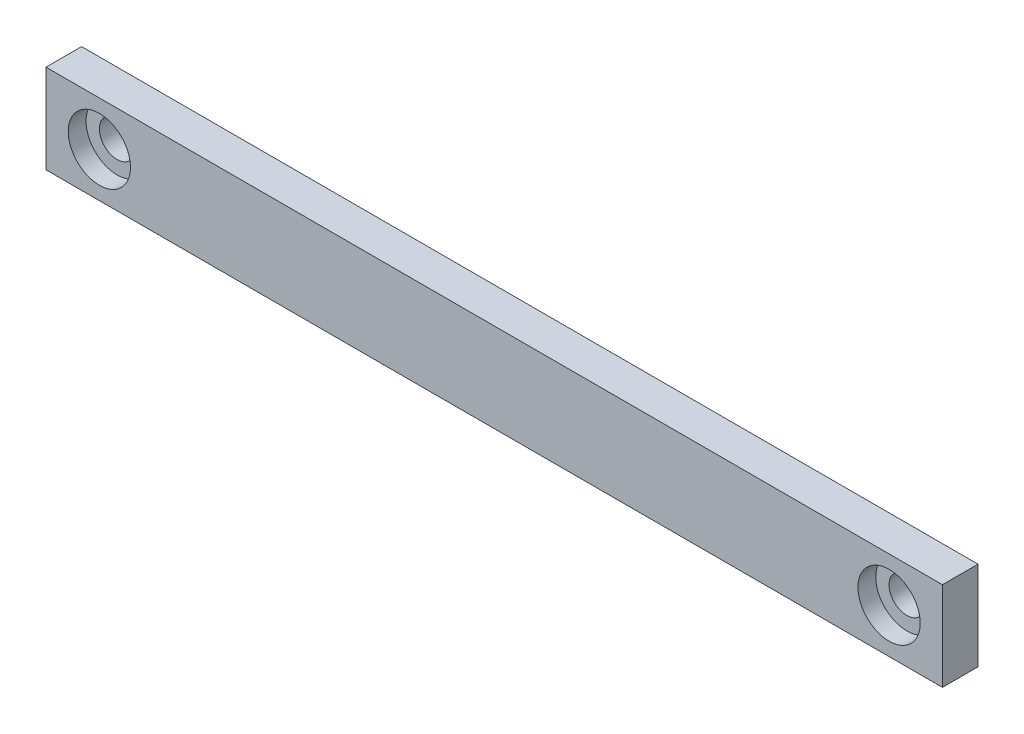
ISO-10303-21;
HEADER;
FILE_DESCRIPTION(('STEP AP214'),'2;1');
FILE_NAME('part.step','',(''),(''),'','','');
FILE_SCHEMA(('AUTOMOTIVE_DESIGN { 1 0 10303 214 1 1 1 1 }'));
ENDSEC;
DATA;
#1=APPLICATION_CONTEXT('core data for automotive mechanical design processes');
#2=APPLICATION_PROTOCOL_DEFINITION('international standard','automotive_design',2000,#1);
#3=PRODUCT_CONTEXT('',#1,'mechanical');
#4=PRODUCT('Part','Part','',(#3));
#5=PRODUCT_RELATED_PRODUCT_CATEGORY('part','',(#4));
#6=PRODUCT_DEFINITION_FORMATION('','',#4);
#7=PRODUCT_DEFINITION_CONTEXT('part definition',#1,'design');
#8=PRODUCT_DEFINITION('design','',#6,#7);
#9=PRODUCT_DEFINITION_SHAPE('','',#8);
#10=(LENGTH_UNIT() NAMED_UNIT(*) SI_UNIT(.MILLI.,.METRE.));
#11=(NAMED_UNIT(*) PLANE_ANGLE_UNIT() SI_UNIT($,.RADIAN.));
#12=(NAMED_UNIT(*) SI_UNIT($,.STERADIAN.) SOLID_ANGLE_UNIT());
#13=UNCERTAINTY_MEASURE_WITH_UNIT(LENGTH_MEASURE(1.E-05),#10,'distance_accuracy_value','');
#14=(GEOMETRIC_REPRESENTATION_CONTEXT(3) GLOBAL_UNCERTAINTY_ASSIGNED_CONTEXT((#13)) GLOBAL_UNIT_ASSIGNED_CONTEXT((#10,
#11,#12)) REPRESENTATION_CONTEXT('',''));
#15=CARTESIAN_POINT('',(0.,0.,0.));
#16=DIRECTION('',(0.,0.,1.));
#17=DIRECTION('',(1.,0.,0.));
#18=AXIS2_PLACEMENT_3D('',#15,#16,#17);
#19=CARTESIAN_POINT('',(0.,0.,2.));
#20=DIRECTION('',(0.,0.,-1.));
#21=DIRECTION('',(-1.,0.,0.));
#22=AXIS2_PLACEMENT_3D('',#19,#20,#21);
#23=PLANE('',#22);
#24=CARTESIAN_POINT('',(3.,-2.5,2.));
#25=DIRECTION('',(0.,0.,-1.));
#26=DIRECTION('',(-1.,0.,0.));
#27=AXIS2_PLACEMENT_3D('',#24,#25,#26);
#28=CIRCLE('',#27,1.75);
#29=CARTESIAN_POINT('',(1.25,-2.5,2.));
#30=VERTEX_POINT('',#29);
#31=EDGE_CURVE('E154',#30,#30,#28,.T.);
#32=ORIENTED_EDGE('',*,*,#31,.T.);
#33=EDGE_LOOP('',(#32));
#34=FACE_BOUND('',#33,.T.);
#35=CARTESIAN_POINT('',(47.4,-2.5,2.));
#36=DIRECTION('',(0.,0.,-1.));
#37=DIRECTION('',(-1.,0.,0.));
#38=AXIS2_PLACEMENT_3D('',#35,#36,#37);
#39=CIRCLE('',#38,1.75);
#40=CARTESIAN_POINT('',(45.65,-2.5,2.));
#41=VERTEX_POINT('',#40);
#42=EDGE_CURVE('E159',#41,#41,#39,.T.);
#43=ORIENTED_EDGE('',*,*,#42,.T.);
#44=EDGE_LOOP('',(#43));
#45=FACE_BOUND('',#44,.T.);
#46=DIRECTION('',(0.,1.,0.));
#47=VECTOR('',#46,1.);
#48=CARTESIAN_POINT('',(0.,-5.,2.));
#49=LINE('',#48,#47);
#50=CARTESIAN_POINT('',(0.,-5.,2.));
#51=VERTEX_POINT('',#50);
#52=CARTESIAN_POINT('',(0.,0.,2.));
#53=VERTEX_POINT('',#52);
#54=EDGE_CURVE('E131',#51,#53,#49,.T.);
#55=ORIENTED_EDGE('',*,*,#54,.F.);
#56=DIRECTION('',(1.,0.,0.));
#57=VECTOR('',#56,1.);
#58=CARTESIAN_POINT('',(0.,-5.,2.));
#59=LINE('',#58,#57);
#60=CARTESIAN_POINT('',(50.4,-5.,2.));
#61=VERTEX_POINT('',#60);
#62=EDGE_CURVE('E120',#51,#61,#59,.T.);
#63=ORIENTED_EDGE('',*,*,#62,.T.);
#64=DIRECTION('',(0.,1.,0.));
#65=VECTOR('',#64,1.);
#66=CARTESIAN_POINT('',(50.4,-5.,2.));
#67=LINE('',#66,#65);
#68=CARTESIAN_POINT('',(50.4,0.,2.));
#69=VERTEX_POINT('',#68);
#70=EDGE_CURVE('E116',#61,#69,#67,.T.);
#71=ORIENTED_EDGE('',*,*,#70,.T.);
#72=DIRECTION('',(1.,0.,0.));
#73=VECTOR('',#72,1.);
#74=CARTESIAN_POINT('',(0.,0.,2.));
#75=LINE('',#74,#73);
#76=EDGE_CURVE('E119',#53,#69,#75,.T.);
#77=ORIENTED_EDGE('',*,*,#76,.F.);
#78=EDGE_LOOP('',(#55,#63,#71,#77));
#79=FACE_BOUND('',#78,.T.);
#80=ADVANCED_FACE('F69',(#34,#45,#79),#23,.F.);
#81=CARTESIAN_POINT('',(0.,0.,0.));
#82=DIRECTION('',(0.,0.,-1.));
#83=DIRECTION('',(-1.,0.,0.));
#84=AXIS2_PLACEMENT_3D('',#81,#82,#83);
#85=PLANE('',#84);
#86=CARTESIAN_POINT('',(3.,-2.5,0.));
#87=DIRECTION('',(0.,0.,1.));
#88=DIRECTION('',(1.,0.,0.));
#89=AXIS2_PLACEMENT_3D('',#86,#87,#88);
#90=CIRCLE('',#89,1.);
#91=CARTESIAN_POINT('',(4.,-2.5,0.));
#92=VERTEX_POINT('',#91);
#93=EDGE_CURVE('E141',#92,#92,#90,.T.);
#94=ORIENTED_EDGE('',*,*,#93,.T.);
#95=EDGE_LOOP('',(#94));
#96=FACE_BOUND('',#95,.T.);
#97=DIRECTION('',(0.,1.,0.));
#98=VECTOR('',#97,1.);
#99=CARTESIAN_POINT('',(0.,-5.,0.));
#100=LINE('',#99,#98);
#101=CARTESIAN_POINT('',(0.,-5.,0.));
#102=VERTEX_POINT('',#101);
#103=CARTESIAN_POINT('',(0.,0.,0.));
#104=VERTEX_POINT('',#103);
#105=EDGE_CURVE('E137',#102,#104,#100,.T.);
#106=ORIENTED_EDGE('',*,*,#105,.T.);
#107=DIRECTION('',(1.,0.,0.));
#108=VECTOR('',#107,1.);
#109=CARTESIAN_POINT('',(0.,0.,0.));
#110=LINE('',#109,#108);
#111=CARTESIAN_POINT('',(50.4,0.,0.));
#112=VERTEX_POINT('',#111);
#113=EDGE_CURVE('E140',#104,#112,#110,.T.);
#114=ORIENTED_EDGE('',*,*,#113,.T.);
#115=DIRECTION('',(0.,1.,0.));
#116=VECTOR('',#115,1.);
#117=CARTESIAN_POINT('',(50.4,-5.,0.));
#118=LINE('',#117,#116);
#119=CARTESIAN_POINT('',(50.4,-5.,0.));
#120=VERTEX_POINT('',#119);
#121=EDGE_CURVE('E127',#120,#112,#118,.T.);
#122=ORIENTED_EDGE('',*,*,#121,.F.);
#123=DIRECTION('',(1.,0.,0.));
#124=VECTOR('',#123,1.);
#125=CARTESIAN_POINT('',(0.,-5.,0.));
#126=LINE('',#125,#124);
#127=EDGE_CURVE('E103',#102,#120,#126,.T.);
#128=ORIENTED_EDGE('',*,*,#127,.F.);
#129=EDGE_LOOP('',(#106,#114,#122,#128));
#130=FACE_BOUND('',#129,.T.);
#131=CARTESIAN_POINT('',(47.4,-2.5,0.));
#132=DIRECTION('',(0.,0.,1.));
#133=DIRECTION('',(1.,0.,0.));
#134=AXIS2_PLACEMENT_3D('',#131,#132,#133);
#135=CIRCLE('',#134,0.999999999999998);
#136=CARTESIAN_POINT('',(48.4,-2.5,0.));
#137=VERTEX_POINT('',#136);
#138=EDGE_CURVE('E152',#137,#137,#135,.T.);
#139=ORIENTED_EDGE('',*,*,#138,.T.);
#140=EDGE_LOOP('',(#139));
#141=FACE_BOUND('',#140,.T.);
#142=ADVANCED_FACE('F171',(#96,#130,#141),#85,.T.);
#143=CARTESIAN_POINT('',(0.,-5.,2.));
#144=DIRECTION('',(-1.,0.,0.));
#145=DIRECTION('',(0.,0.,1.));
#146=AXIS2_PLACEMENT_3D('',#143,#144,#145);
#147=PLANE('',#146);
#148=ORIENTED_EDGE('',*,*,#105,.F.);
#149=DIRECTION('',(0.,0.,-1.));
#150=VECTOR('',#149,1.);
#151=CARTESIAN_POINT('',(0.,-5.,2.));
#152=LINE('',#151,#150);
#153=EDGE_CURVE('E12',#51,#102,#152,.T.);
#154=ORIENTED_EDGE('',*,*,#153,.F.);
#155=ORIENTED_EDGE('',*,*,#54,.T.);
#156=DIRECTION('',(0.,0.,-1.));
#157=VECTOR('',#156,1.);
#158=CARTESIAN_POINT('',(0.,0.,2.));
#159=LINE('',#158,#157);
#160=EDGE_CURVE('E111',#53,#104,#159,.T.);
#161=ORIENTED_EDGE('',*,*,#160,.T.);
#162=EDGE_LOOP('',(#148,#154,#155,#161));
#163=FACE_BOUND('',#162,.T.);
#164=ADVANCED_FACE('F71',(#163),#147,.T.);
#165=CARTESIAN_POINT('',(0.,-5.,2.));
#166=DIRECTION('',(0.,1.,0.));
#167=DIRECTION('',(0.,0.,1.));
#168=AXIS2_PLACEMENT_3D('',#165,#166,#167);
#169=PLANE('',#168);
#170=ORIENTED_EDGE('',*,*,#127,.T.);
#171=DIRECTION('',(0.,0.,-1.));
#172=VECTOR('',#171,1.);
#173=CARTESIAN_POINT('',(50.4,-5.,2.));
#174=LINE('',#173,#172);
#175=EDGE_CURVE('E79',#61,#120,#174,.T.);
#176=ORIENTED_EDGE('',*,*,#175,.F.);
#177=ORIENTED_EDGE('',*,*,#62,.F.);
#178=ORIENTED_EDGE('',*,*,#153,.T.);
#179=EDGE_LOOP('',(#170,#176,#177,#178));
#180=FACE_BOUND('',#179,.T.);
#181=ADVANCED_FACE('F197',(#180),#169,.F.);
#182=CARTESIAN_POINT('',(50.4,-5.,2.));
#183=DIRECTION('',(-1.,0.,0.));
#184=DIRECTION('',(0.,0.,1.));
#185=AXIS2_PLACEMENT_3D('',#182,#183,#184);
#186=PLANE('',#185);
#187=ORIENTED_EDGE('',*,*,#121,.T.);
#188=DIRECTION('',(0.,0.,-1.));
#189=VECTOR('',#188,1.);
#190=CARTESIAN_POINT('',(50.4,0.,2.));
#191=LINE('',#190,#189);
#192=EDGE_CURVE('E124',#69,#112,#191,.T.);
#193=ORIENTED_EDGE('',*,*,#192,.F.);
#194=ORIENTED_EDGE('',*,*,#70,.F.);
#195=ORIENTED_EDGE('',*,*,#175,.T.);
#196=EDGE_LOOP('',(#187,#193,#194,#195));
#197=FACE_BOUND('',#196,.T.);
#198=ADVANCED_FACE('F125',(#197),#186,.F.);
#199=CARTESIAN_POINT('',(0.,0.,2.));
#200=DIRECTION('',(0.,1.,0.));
#201=DIRECTION('',(0.,0.,1.));
#202=AXIS2_PLACEMENT_3D('',#199,#200,#201);
#203=PLANE('',#202);
#204=ORIENTED_EDGE('',*,*,#113,.F.);
#205=ORIENTED_EDGE('',*,*,#160,.F.);
#206=ORIENTED_EDGE('',*,*,#76,.T.);
#207=ORIENTED_EDGE('',*,*,#192,.T.);
#208=EDGE_LOOP('',(#204,#205,#206,#207));
#209=FACE_BOUND('',#208,.T.);
#210=ADVANCED_FACE('F130',(#209),#203,.T.);
#211=CARTESIAN_POINT('',(3.,-2.5,2.));
#212=DIRECTION('',(0.,0.,-1.));
#213=DIRECTION('',(-1.,0.,0.));
#214=AXIS2_PLACEMENT_3D('',#211,#212,#213);
#215=CYLINDRICAL_SURFACE('',#214,1.);
#216=CARTESIAN_POINT('',(3.,-2.5,1.));
#217=DIRECTION('',(0.,0.,-1.));
#218=DIRECTION('',(-1.,0.,0.));
#219=AXIS2_PLACEMENT_3D('',#216,#217,#218);
#220=CIRCLE('',#219,1.);
#221=CARTESIAN_POINT('',(2.,-2.5,1.));
#222=VERTEX_POINT('',#221);
#223=EDGE_CURVE('E73',#222,#222,#220,.T.);
#224=ORIENTED_EDGE('',*,*,#223,.F.);
#225=EDGE_LOOP('',(#224));
#226=FACE_BOUND('',#225,.T.);
#227=ORIENTED_EDGE('',*,*,#93,.F.);
#228=EDGE_LOOP('',(#227));
#229=FACE_BOUND('',#228,.T.);
#230=ADVANCED_FACE('F174',(#226,#229),#215,.F.);
#231=CARTESIAN_POINT('',(47.4,-2.5,2.));
#232=DIRECTION('',(0.,0.,-1.));
#233=DIRECTION('',(-1.,0.,0.));
#234=AXIS2_PLACEMENT_3D('',#231,#232,#233);
#235=CYLINDRICAL_SURFACE('',#234,0.999999999999998);
#236=CARTESIAN_POINT('',(47.4,-2.5,1.));
#237=DIRECTION('',(0.,0.,-1.));
#238=DIRECTION('',(-1.,0.,0.));
#239=AXIS2_PLACEMENT_3D('',#236,#237,#238);
#240=CIRCLE('',#239,0.999999999999998);
#241=CARTESIAN_POINT('',(46.4,-2.5,1.));
#242=VERTEX_POINT('',#241);
#243=EDGE_CURVE('E146',#242,#242,#240,.T.);
#244=ORIENTED_EDGE('',*,*,#243,.F.);
#245=EDGE_LOOP('',(#244));
#246=FACE_BOUND('',#245,.T.);
#247=ORIENTED_EDGE('',*,*,#138,.F.);
#248=EDGE_LOOP('',(#247));
#249=FACE_BOUND('',#248,.T.);
#250=ADVANCED_FACE('F176',(#246,#249),#235,.F.);
#251=CARTESIAN_POINT('',(47.4,-2.5,1.));
#252=DIRECTION('',(0.,0.,1.));
#253=DIRECTION('',(1.,0.,0.));
#254=AXIS2_PLACEMENT_3D('',#251,#252,#253);
#255=CYLINDRICAL_SURFACE('',#254,1.75);
#256=CARTESIAN_POINT('',(47.4,-2.5,1.));
#257=DIRECTION('',(0.,0.,-1.));
#258=DIRECTION('',(-1.,0.,0.));
#259=AXIS2_PLACEMENT_3D('',#256,#257,#258);
#260=CIRCLE('',#259,1.75);
#261=CARTESIAN_POINT('',(45.65,-2.5,1.));
#262=VERTEX_POINT('',#261);
#263=EDGE_CURVE('E164',#262,#262,#260,.T.);
#264=ORIENTED_EDGE('',*,*,#263,.T.);
#265=EDGE_LOOP('',(#264));
#266=FACE_BOUND('',#265,.T.);
#267=ORIENTED_EDGE('',*,*,#42,.F.);
#268=EDGE_LOOP('',(#267));
#269=FACE_BOUND('',#268,.T.);
#270=ADVANCED_FACE('F183',(#266,#269),#255,.F.);
#271=CARTESIAN_POINT('',(47.4,-2.5,1.));
#272=DIRECTION('',(0.,0.,-1.));
#273=DIRECTION('',(-1.,0.,0.));
#274=AXIS2_PLACEMENT_3D('',#271,#272,#273);
#275=PLANE('',#274);
#276=ORIENTED_EDGE('',*,*,#243,.T.);
#277=EDGE_LOOP('',(#276));
#278=FACE_BOUND('',#277,.T.);
#279=ORIENTED_EDGE('',*,*,#263,.F.);
#280=EDGE_LOOP('',(#279));
#281=FACE_BOUND('',#280,.T.);
#282=ADVANCED_FACE('F228',(#278,#281),#275,.F.);
#283=CARTESIAN_POINT('',(3.,-2.5,1.));
#284=DIRECTION('',(0.,0.,1.));
#285=DIRECTION('',(1.,0.,0.));
#286=AXIS2_PLACEMENT_3D('',#283,#284,#285);
#287=CYLINDRICAL_SURFACE('',#286,1.75);
#288=CARTESIAN_POINT('',(3.,-2.5,1.));
#289=DIRECTION('',(0.,0.,-1.));
#290=DIRECTION('',(-1.,0.,0.));
#291=AXIS2_PLACEMENT_3D('',#288,#289,#290);
#292=CIRCLE('',#291,1.75);
#293=CARTESIAN_POINT('',(1.25,-2.5,1.));
#294=VERTEX_POINT('',#293);
#295=EDGE_CURVE('E148',#294,#294,#292,.T.);
#296=ORIENTED_EDGE('',*,*,#295,.T.);
#297=EDGE_LOOP('',(#296));
#298=FACE_BOUND('',#297,.T.);
#299=ORIENTED_EDGE('',*,*,#31,.F.);
#300=EDGE_LOOP('',(#299));
#301=FACE_BOUND('',#300,.T.);
#302=ADVANCED_FACE('F235',(#298,#301),#287,.F.);
#303=CARTESIAN_POINT('',(3.,-2.5,1.));
#304=DIRECTION('',(0.,0.,-1.));
#305=DIRECTION('',(-1.,0.,0.));
#306=AXIS2_PLACEMENT_3D('',#303,#304,#305);
#307=PLANE('',#306);
#308=ORIENTED_EDGE('',*,*,#223,.T.);
#309=EDGE_LOOP('',(#308));
#310=FACE_BOUND('',#309,.T.);
#311=ORIENTED_EDGE('',*,*,#295,.F.);
#312=EDGE_LOOP('',(#311));
#313=FACE_BOUND('',#312,.T.);
#314=ADVANCED_FACE('F242',(#310,#313),#307,.F.);
#315=CLOSED_SHELL('',(#80,#142,#164,#181,#198,#210,#230,#250,#270,#282,#302,#314));
#316=MANIFOLD_SOLID_BREP('B2',#315);
#317=ADVANCED_BREP_SHAPE_REPRESENTATION('',(#18,#316),#14);
#318=SHAPE_DEFINITION_REPRESENTATION(#9,#317);
ENDSEC;
END-ISO-10303-21;
